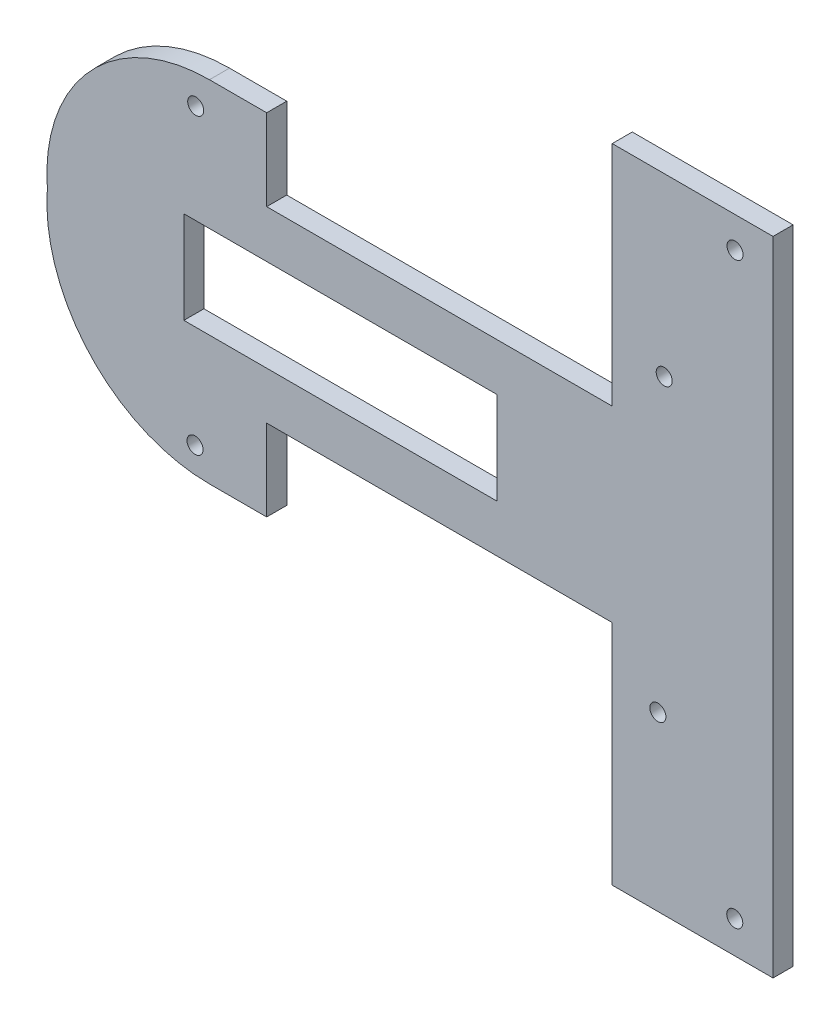
ISO-10303-21;
HEADER;
FILE_DESCRIPTION(('STEP AP214'),'2;1');
FILE_NAME('part.step','',(''),(''),'','','');
FILE_SCHEMA(('AUTOMOTIVE_DESIGN { 1 0 10303 214 1 1 1 1 }'));
ENDSEC;
DATA;
#1=APPLICATION_CONTEXT('core data for automotive mechanical design processes');
#2=APPLICATION_PROTOCOL_DEFINITION('international standard','automotive_design',2000,#1);
#3=PRODUCT_CONTEXT('',#1,'mechanical');
#4=PRODUCT('Part','Part','',(#3));
#5=PRODUCT_RELATED_PRODUCT_CATEGORY('part','',(#4));
#6=PRODUCT_DEFINITION_FORMATION('','',#4);
#7=PRODUCT_DEFINITION_CONTEXT('part definition',#1,'design');
#8=PRODUCT_DEFINITION('design','',#6,#7);
#9=PRODUCT_DEFINITION_SHAPE('','',#8);
#10=(LENGTH_UNIT() NAMED_UNIT(*) SI_UNIT(.MILLI.,.METRE.));
#11=(NAMED_UNIT(*) PLANE_ANGLE_UNIT() SI_UNIT($,.RADIAN.));
#12=(NAMED_UNIT(*) SI_UNIT($,.STERADIAN.) SOLID_ANGLE_UNIT());
#13=UNCERTAINTY_MEASURE_WITH_UNIT(LENGTH_MEASURE(1.E-05),#10,'distance_accuracy_value','');
#14=(GEOMETRIC_REPRESENTATION_CONTEXT(3) GLOBAL_UNCERTAINTY_ASSIGNED_CONTEXT((#13)) GLOBAL_UNIT_ASSIGNED_CONTEXT((#10,
#11,#12)) REPRESENTATION_CONTEXT('',''));
#15=CARTESIAN_POINT('',(0.,0.,0.));
#16=DIRECTION('',(0.,0.,1.));
#17=DIRECTION('',(1.,0.,0.));
#18=AXIS2_PLACEMENT_3D('',#15,#16,#17);
#19=CARTESIAN_POINT('',(-140.404811955513,-3.10456604475191,5.));
#20=DIRECTION('',(0.,0.,-1.));
#21=DIRECTION('',(-1.,0.,0.));
#22=AXIS2_PLACEMENT_3D('',#19,#20,#21);
#23=PLANE('',#22);
#24=DIRECTION('',(0.,-1.,0.));
#25=VECTOR('',#24,1.);
#26=CARTESIAN_POINT('',(-146.776795964577,-11.5,5.));
#27=LINE('',#26,#25);
#28=CARTESIAN_POINT('',(-146.776795964577,11.5,5.));
#29=VERTEX_POINT('',#28);
#30=CARTESIAN_POINT('',(-146.776795964577,-11.5,5.));
#31=VERTEX_POINT('',#30);
#32=EDGE_CURVE('E179',#29,#31,#27,.T.);
#33=ORIENTED_EDGE('',*,*,#32,.F.);
#34=DIRECTION('',(-1.,0.,0.));
#35=VECTOR('',#34,1.);
#36=CARTESIAN_POINT('',(-146.776795964577,11.5,5.));
#37=LINE('',#36,#35);
#38=CARTESIAN_POINT('',(-68.7767959645772,11.5,5.));
#39=VERTEX_POINT('',#38);
#40=EDGE_CURVE('E48',#39,#29,#37,.T.);
#41=ORIENTED_EDGE('',*,*,#40,.F.);
#42=DIRECTION('',(0.,1.,0.));
#43=VECTOR('',#42,1.);
#44=CARTESIAN_POINT('',(-68.7767959645772,11.5,5.));
#45=LINE('',#44,#43);
#46=CARTESIAN_POINT('',(-68.7767959645772,-11.5,5.));
#47=VERTEX_POINT('',#46);
#48=EDGE_CURVE('E170',#47,#39,#45,.T.);
#49=ORIENTED_EDGE('',*,*,#48,.F.);
#50=DIRECTION('',(1.,0.,0.));
#51=VECTOR('',#50,1.);
#52=CARTESIAN_POINT('',(-146.776795964577,-11.5,5.));
#53=LINE('',#52,#51);
#54=EDGE_CURVE('E173',#31,#47,#53,.T.);
#55=ORIENTED_EDGE('',*,*,#54,.F.);
#56=EDGE_LOOP('',(#33,#41,#49,#55));
#57=FACE_BOUND('',#56,.T.);
#58=CARTESIAN_POINT('',(-140.404811955513,-3.10456604475191,5.));
#59=DIRECTION('',(0.,0.,1.));
#60=DIRECTION('',(-1.,0.,0.));
#61=AXIS2_PLACEMENT_3D('',#58,#59,#60);
#62=CIRCLE('',#61,40.5034622947359);
#63=CARTESIAN_POINT('',(-180.789117416111,0.,5.));
#64=VERTEX_POINT('',#63);
#65=CARTESIAN_POINT('',(-140.404811955513,-43.6080283394878,5.));
#66=VERTEX_POINT('',#65);
#67=EDGE_CURVE('E225',#64,#66,#62,.T.);
#68=ORIENTED_EDGE('',*,*,#67,.T.);
#69=DIRECTION('',(1.,0.,0.));
#70=VECTOR('',#69,1.);
#71=CARTESIAN_POINT('',(-140.404811955513,-43.6080283394878,5.));
#72=LINE('',#71,#70);
#73=CARTESIAN_POINT('',(-126.14466040982,-43.6080283394878,5.));
#74=VERTEX_POINT('',#73);
#75=EDGE_CURVE('E228',#66,#74,#72,.T.);
#76=ORIENTED_EDGE('',*,*,#75,.T.);
#77=DIRECTION('',(0.,1.,0.));
#78=VECTOR('',#77,1.);
#79=CARTESIAN_POINT('',(-126.14466040982,-43.6080283394878,5.));
#80=LINE('',#79,#78);
#81=CARTESIAN_POINT('',(-126.14466040982,-23.3472038346006,5.));
#82=VERTEX_POINT('',#81);
#83=EDGE_CURVE('E231',#74,#82,#80,.T.);
#84=ORIENTED_EDGE('',*,*,#83,.T.);
#85=DIRECTION('',(1.,0.,0.));
#86=VECTOR('',#85,1.);
#87=CARTESIAN_POINT('',(-126.14466040982,-23.3472038346006,5.));
#88=LINE('',#87,#86);
#89=CARTESIAN_POINT('',(-40.0633573953098,-23.3472038346006,5.));
#90=VERTEX_POINT('',#89);
#91=EDGE_CURVE('E233',#82,#90,#88,.T.);
#92=ORIENTED_EDGE('',*,*,#91,.T.);
#93=DIRECTION('',(0.,-1.,0.));
#94=VECTOR('',#93,1.);
#95=CARTESIAN_POINT('',(-40.0633573953098,-23.3472038346006,5.));
#96=LINE('',#95,#94);
#97=CARTESIAN_POINT('',(-40.0633573953098,-80.,5.));
#98=VERTEX_POINT('',#97);
#99=EDGE_CURVE('E235',#90,#98,#96,.T.);
#100=ORIENTED_EDGE('',*,*,#99,.T.);
#101=DIRECTION('',(1.,0.,0.));
#102=VECTOR('',#101,1.);
#103=CARTESIAN_POINT('',(0.,-80.,5.));
#104=LINE('',#103,#102);
#105=CARTESIAN_POINT('',(0.,-80.,5.));
#106=VERTEX_POINT('',#105);
#107=EDGE_CURVE('E237',#98,#106,#104,.T.);
#108=ORIENTED_EDGE('',*,*,#107,.T.);
#109=DIRECTION('',(0.,1.,0.));
#110=VECTOR('',#109,1.);
#111=CARTESIAN_POINT('',(0.,-80.,5.));
#112=LINE('',#111,#110);
#113=CARTESIAN_POINT('',(0.,80.,5.));
#114=VERTEX_POINT('',#113);
#115=EDGE_CURVE('E239',#106,#114,#112,.T.);
#116=ORIENTED_EDGE('',*,*,#115,.T.);
#117=DIRECTION('',(-1.,0.,0.));
#118=VECTOR('',#117,1.);
#119=CARTESIAN_POINT('',(0.,80.,5.));
#120=LINE('',#119,#118);
#121=CARTESIAN_POINT('',(-40.0633573953098,80.,5.));
#122=VERTEX_POINT('',#121);
#123=EDGE_CURVE('E241',#114,#122,#120,.T.);
#124=ORIENTED_EDGE('',*,*,#123,.T.);
#125=DIRECTION('',(0.,-1.,0.));
#126=VECTOR('',#125,1.);
#127=CARTESIAN_POINT('',(-40.0633573953098,80.,5.));
#128=LINE('',#127,#126);
#129=CARTESIAN_POINT('',(-40.0633573953098,23.3472038346006,5.));
#130=VERTEX_POINT('',#129);
#131=EDGE_CURVE('E243',#122,#130,#128,.T.);
#132=ORIENTED_EDGE('',*,*,#131,.T.);
#133=DIRECTION('',(-1.,0.,0.));
#134=VECTOR('',#133,1.);
#135=CARTESIAN_POINT('',(-126.14466040982,23.3472038346006,5.));
#136=LINE('',#135,#134);
#137=CARTESIAN_POINT('',(-126.14466040982,23.3472038346006,5.));
#138=VERTEX_POINT('',#137);
#139=EDGE_CURVE('E245',#130,#138,#136,.T.);
#140=ORIENTED_EDGE('',*,*,#139,.T.);
#141=DIRECTION('',(0.,1.,0.));
#142=VECTOR('',#141,1.);
#143=CARTESIAN_POINT('',(-126.14466040982,43.6080283394878,5.));
#144=LINE('',#143,#142);
#145=CARTESIAN_POINT('',(-126.14466040982,43.6080283394878,5.));
#146=VERTEX_POINT('',#145);
#147=EDGE_CURVE('E247',#138,#146,#144,.T.);
#148=ORIENTED_EDGE('',*,*,#147,.T.);
#149=DIRECTION('',(-1.,0.,0.));
#150=VECTOR('',#149,1.);
#151=CARTESIAN_POINT('',(-140.404811955513,43.6080283394878,5.));
#152=LINE('',#151,#150);
#153=CARTESIAN_POINT('',(-140.404811955513,43.6080283394878,5.));
#154=VERTEX_POINT('',#153);
#155=EDGE_CURVE('E249',#146,#154,#152,.T.);
#156=ORIENTED_EDGE('',*,*,#155,.T.);
#157=CARTESIAN_POINT('',(-140.404811955513,3.10456604475187,5.));
#158=DIRECTION('',(0.,0.,1.));
#159=DIRECTION('',(1.,0.,0.));
#160=AXIS2_PLACEMENT_3D('',#157,#158,#159);
#161=CIRCLE('',#160,40.5034622947359);
#162=EDGE_CURVE('E251',#154,#64,#161,.T.);
#163=ORIENTED_EDGE('',*,*,#162,.T.);
#164=EDGE_LOOP('',(#68,#76,#84,#92,#100,#108,#116,#124,#132,#140,#148,#156,#163));
#165=FACE_BOUND('',#164,.T.);
#166=CARTESIAN_POINT('',(-9.53802285725849,-71.9475460170679,5.));
#167=DIRECTION('',(0.,0.,1.));
#168=DIRECTION('',(-1.,0.,0.));
#169=AXIS2_PLACEMENT_3D('',#166,#167,#168);
#170=CIRCLE('',#169,2.);
#171=CARTESIAN_POINT('',(-11.5380228572585,-71.9475460170679,5.));
#172=VERTEX_POINT('',#171);
#173=EDGE_CURVE('E219',#172,#172,#170,.T.);
#174=ORIENTED_EDGE('',*,*,#173,.F.);
#175=EDGE_LOOP('',(#174));
#176=FACE_BOUND('',#175,.T.);
#177=CARTESIAN_POINT('',(-143.829395776863,36.2065798242247,5.));
#178=DIRECTION('',(0.,0.,1.));
#179=DIRECTION('',(1.,0.,0.));
#180=AXIS2_PLACEMENT_3D('',#177,#178,#179);
#181=CIRCLE('',#180,2.);
#182=CARTESIAN_POINT('',(-141.829395776863,36.2065798242247,5.));
#183=VERTEX_POINT('',#182);
#184=EDGE_CURVE('E213',#183,#183,#181,.T.);
#185=ORIENTED_EDGE('',*,*,#184,.F.);
#186=EDGE_LOOP('',(#185));
#187=FACE_BOUND('',#186,.T.);
#188=CARTESIAN_POINT('',(-27.1130683064686,36.2065798242247,5.));
#189=DIRECTION('',(0.,0.,1.));
#190=DIRECTION('',(1.,0.,0.));
#191=AXIS2_PLACEMENT_3D('',#188,#189,#190);
#192=CIRCLE('',#191,2.);
#193=CARTESIAN_POINT('',(-25.1130683064686,36.2065798242247,5.));
#194=VERTEX_POINT('',#193);
#195=EDGE_CURVE('E207',#194,#194,#192,.T.);
#196=ORIENTED_EDGE('',*,*,#195,.F.);
#197=EDGE_LOOP('',(#196));
#198=FACE_BOUND('',#197,.T.);
#199=CARTESIAN_POINT('',(-28.6903159749874,-37.0227762141505,5.));
#200=DIRECTION('',(0.,0.,1.));
#201=DIRECTION('',(-1.,0.,0.));
#202=AXIS2_PLACEMENT_3D('',#199,#200,#201);
#203=CIRCLE('',#202,2.);
#204=CARTESIAN_POINT('',(-30.6903159749874,-37.0227762141505,5.));
#205=VERTEX_POINT('',#204);
#206=EDGE_CURVE('E201',#205,#205,#203,.T.);
#207=ORIENTED_EDGE('',*,*,#206,.F.);
#208=EDGE_LOOP('',(#207));
#209=FACE_BOUND('',#208,.T.);
#210=CARTESIAN_POINT('',(-143.994710804854,-37.0227762141505,5.));
#211=DIRECTION('',(0.,0.,1.));
#212=DIRECTION('',(-1.,0.,0.));
#213=AXIS2_PLACEMENT_3D('',#210,#211,#212);
#214=CIRCLE('',#213,2.);
#215=CARTESIAN_POINT('',(-145.994710804854,-37.0227762141505,5.));
#216=VERTEX_POINT('',#215);
#217=EDGE_CURVE('E195',#216,#216,#214,.T.);
#218=ORIENTED_EDGE('',*,*,#217,.F.);
#219=EDGE_LOOP('',(#218));
#220=FACE_BOUND('',#219,.T.);
#221=CARTESIAN_POINT('',(-9.46712879267102,72.2918239197636,5.));
#222=DIRECTION('',(0.,0.,1.));
#223=DIRECTION('',(1.,0.,0.));
#224=AXIS2_PLACEMENT_3D('',#221,#222,#223);
#225=CIRCLE('',#224,2.);
#226=CARTESIAN_POINT('',(-7.46712879267102,72.2918239197636,5.));
#227=VERTEX_POINT('',#226);
#228=EDGE_CURVE('E189',#227,#227,#225,.T.);
#229=ORIENTED_EDGE('',*,*,#228,.F.);
#230=EDGE_LOOP('',(#229));
#231=FACE_BOUND('',#230,.T.);
#232=ADVANCED_FACE('F33',(#57,#165,#176,#187,#198,#209,#220,#231),#23,.F.);
#233=CARTESIAN_POINT('',(-140.404811955513,-3.10456604475191,0.));
#234=DIRECTION('',(0.,0.,-1.));
#235=DIRECTION('',(-1.,0.,0.));
#236=AXIS2_PLACEMENT_3D('',#233,#234,#235);
#237=PLANE('',#236);
#238=DIRECTION('',(-1.,0.,0.));
#239=VECTOR('',#238,1.);
#240=CARTESIAN_POINT('',(-146.776795964577,11.5,0.));
#241=LINE('',#240,#239);
#242=CARTESIAN_POINT('',(-68.7767959645772,11.5,0.));
#243=VERTEX_POINT('',#242);
#244=CARTESIAN_POINT('',(-146.776795964577,11.5,0.));
#245=VERTEX_POINT('',#244);
#246=EDGE_CURVE('E154',#243,#245,#241,.T.);
#247=ORIENTED_EDGE('',*,*,#246,.T.);
#248=DIRECTION('',(0.,-1.,0.));
#249=VECTOR('',#248,1.);
#250=CARTESIAN_POINT('',(-146.776795964577,-11.5,0.));
#251=LINE('',#250,#249);
#252=CARTESIAN_POINT('',(-146.776795964577,-11.5,0.));
#253=VERTEX_POINT('',#252);
#254=EDGE_CURVE('E163',#245,#253,#251,.T.);
#255=ORIENTED_EDGE('',*,*,#254,.T.);
#256=DIRECTION('',(1.,0.,0.));
#257=VECTOR('',#256,1.);
#258=CARTESIAN_POINT('',(-146.776795964577,-11.5,0.));
#259=LINE('',#258,#257);
#260=CARTESIAN_POINT('',(-68.7767959645772,-11.5,0.));
#261=VERTEX_POINT('',#260);
#262=EDGE_CURVE('E56',#253,#261,#259,.T.);
#263=ORIENTED_EDGE('',*,*,#262,.T.);
#264=DIRECTION('',(0.,1.,0.));
#265=VECTOR('',#264,1.);
#266=CARTESIAN_POINT('',(-68.7767959645772,11.5,0.));
#267=LINE('',#266,#265);
#268=EDGE_CURVE('E160',#261,#243,#267,.T.);
#269=ORIENTED_EDGE('',*,*,#268,.T.);
#270=EDGE_LOOP('',(#247,#255,#263,#269));
#271=FACE_BOUND('',#270,.T.);
#272=CARTESIAN_POINT('',(-143.994710804854,-37.0227762141505,0.));
#273=DIRECTION('',(0.,0.,1.));
#274=DIRECTION('',(-1.,0.,0.));
#275=AXIS2_PLACEMENT_3D('',#272,#273,#274);
#276=CIRCLE('',#275,2.);
#277=CARTESIAN_POINT('',(-145.994710804854,-37.0227762141505,0.));
#278=VERTEX_POINT('',#277);
#279=EDGE_CURVE('E192',#278,#278,#276,.T.);
#280=ORIENTED_EDGE('',*,*,#279,.T.);
#281=EDGE_LOOP('',(#280));
#282=FACE_BOUND('',#281,.T.);
#283=CARTESIAN_POINT('',(-27.1130683064686,36.2065798242247,0.));
#284=DIRECTION('',(0.,0.,1.));
#285=DIRECTION('',(1.,0.,0.));
#286=AXIS2_PLACEMENT_3D('',#283,#284,#285);
#287=CIRCLE('',#286,2.);
#288=CARTESIAN_POINT('',(-25.1130683064686,36.2065798242247,0.));
#289=VERTEX_POINT('',#288);
#290=EDGE_CURVE('E204',#289,#289,#287,.T.);
#291=ORIENTED_EDGE('',*,*,#290,.T.);
#292=EDGE_LOOP('',(#291));
#293=FACE_BOUND('',#292,.T.);
#294=CARTESIAN_POINT('',(-9.53802285725849,-71.9475460170679,0.));
#295=DIRECTION('',(0.,0.,1.));
#296=DIRECTION('',(-1.,0.,0.));
#297=AXIS2_PLACEMENT_3D('',#294,#295,#296);
#298=CIRCLE('',#297,2.);
#299=CARTESIAN_POINT('',(-11.5380228572585,-71.9475460170679,0.));
#300=VERTEX_POINT('',#299);
#301=EDGE_CURVE('E216',#300,#300,#298,.T.);
#302=ORIENTED_EDGE('',*,*,#301,.T.);
#303=EDGE_LOOP('',(#302));
#304=FACE_BOUND('',#303,.T.);
#305=CARTESIAN_POINT('',(-140.404811955513,-3.10456604475191,0.));
#306=DIRECTION('',(0.,0.,1.));
#307=DIRECTION('',(-1.,0.,0.));
#308=AXIS2_PLACEMENT_3D('',#305,#306,#307);
#309=CIRCLE('',#308,40.5034622947359);
#310=CARTESIAN_POINT('',(-180.789117416111,0.,0.));
#311=VERTEX_POINT('',#310);
#312=CARTESIAN_POINT('',(-140.404811955513,-43.6080283394878,0.));
#313=VERTEX_POINT('',#312);
#314=EDGE_CURVE('E222',#311,#313,#309,.T.);
#315=ORIENTED_EDGE('',*,*,#314,.F.);
#316=CARTESIAN_POINT('',(-140.404811955513,3.10456604475187,0.));
#317=DIRECTION('',(0.,0.,1.));
#318=DIRECTION('',(1.,0.,0.));
#319=AXIS2_PLACEMENT_3D('',#316,#317,#318);
#320=CIRCLE('',#319,40.5034622947359);
#321=CARTESIAN_POINT('',(-140.404811955513,43.6080283394878,0.));
#322=VERTEX_POINT('',#321);
#323=EDGE_CURVE('E229',#322,#311,#320,.T.);
#324=ORIENTED_EDGE('',*,*,#323,.F.);
#325=DIRECTION('',(-1.,0.,0.));
#326=VECTOR('',#325,1.);
#327=CARTESIAN_POINT('',(-140.404811955513,43.6080283394878,0.));
#328=LINE('',#327,#326);
#329=CARTESIAN_POINT('',(-126.14466040982,43.6080283394878,0.));
#330=VERTEX_POINT('',#329);
#331=EDGE_CURVE('E278',#330,#322,#328,.T.);
#332=ORIENTED_EDGE('',*,*,#331,.F.);
#333=DIRECTION('',(0.,1.,0.));
#334=VECTOR('',#333,1.);
#335=CARTESIAN_POINT('',(-126.14466040982,43.6080283394878,0.));
#336=LINE('',#335,#334);
#337=CARTESIAN_POINT('',(-126.14466040982,23.3472038346006,0.));
#338=VERTEX_POINT('',#337);
#339=EDGE_CURVE('E276',#338,#330,#336,.T.);
#340=ORIENTED_EDGE('',*,*,#339,.F.);
#341=DIRECTION('',(-1.,0.,0.));
#342=VECTOR('',#341,1.);
#343=CARTESIAN_POINT('',(-126.14466040982,23.3472038346006,0.));
#344=LINE('',#343,#342);
#345=CARTESIAN_POINT('',(-40.0633573953098,23.3472038346006,0.));
#346=VERTEX_POINT('',#345);
#347=EDGE_CURVE('E274',#346,#338,#344,.T.);
#348=ORIENTED_EDGE('',*,*,#347,.F.);
#349=DIRECTION('',(0.,-1.,0.));
#350=VECTOR('',#349,1.);
#351=CARTESIAN_POINT('',(-40.0633573953098,23.3472038346006,0.));
#352=LINE('',#351,#350);
#353=CARTESIAN_POINT('',(-40.0633573953098,80.,0.));
#354=VERTEX_POINT('',#353);
#355=EDGE_CURVE('E272',#354,#346,#352,.T.);
#356=ORIENTED_EDGE('',*,*,#355,.F.);
#357=DIRECTION('',(-1.,0.,0.));
#358=VECTOR('',#357,1.);
#359=CARTESIAN_POINT('',(0.,80.,0.));
#360=LINE('',#359,#358);
#361=CARTESIAN_POINT('',(0.,80.,0.));
#362=VERTEX_POINT('',#361);
#363=EDGE_CURVE('E269',#362,#354,#360,.T.);
#364=ORIENTED_EDGE('',*,*,#363,.F.);
#365=DIRECTION('',(0.,1.,0.));
#366=VECTOR('',#365,1.);
#367=CARTESIAN_POINT('',(0.,-80.,0.));
#368=LINE('',#367,#366);
#369=CARTESIAN_POINT('',(0.,-80.,0.));
#370=VERTEX_POINT('',#369);
#371=EDGE_CURVE('E267',#370,#362,#368,.T.);
#372=ORIENTED_EDGE('',*,*,#371,.F.);
#373=DIRECTION('',(1.,0.,0.));
#374=VECTOR('',#373,1.);
#375=CARTESIAN_POINT('',(0.,-80.,0.));
#376=LINE('',#375,#374);
#377=CARTESIAN_POINT('',(-40.0633573953098,-80.,0.));
#378=VERTEX_POINT('',#377);
#379=EDGE_CURVE('E265',#378,#370,#376,.T.);
#380=ORIENTED_EDGE('',*,*,#379,.F.);
#381=DIRECTION('',(0.,-1.,0.));
#382=VECTOR('',#381,1.);
#383=CARTESIAN_POINT('',(-40.0633573953098,-80.,0.));
#384=LINE('',#383,#382);
#385=CARTESIAN_POINT('',(-40.0633573953098,-23.3472038346006,0.));
#386=VERTEX_POINT('',#385);
#387=EDGE_CURVE('E263',#386,#378,#384,.T.);
#388=ORIENTED_EDGE('',*,*,#387,.F.);
#389=DIRECTION('',(1.,0.,0.));
#390=VECTOR('',#389,1.);
#391=CARTESIAN_POINT('',(-126.14466040982,-23.3472038346006,0.));
#392=LINE('',#391,#390);
#393=CARTESIAN_POINT('',(-126.14466040982,-23.3472038346006,0.));
#394=VERTEX_POINT('',#393);
#395=EDGE_CURVE('E260',#394,#386,#392,.T.);
#396=ORIENTED_EDGE('',*,*,#395,.F.);
#397=DIRECTION('',(0.,1.,0.));
#398=VECTOR('',#397,1.);
#399=CARTESIAN_POINT('',(-126.14466040982,-43.6080283394878,0.));
#400=LINE('',#399,#398);
#401=CARTESIAN_POINT('',(-126.14466040982,-43.6080283394878,0.));
#402=VERTEX_POINT('',#401);
#403=EDGE_CURVE('E258',#402,#394,#400,.T.);
#404=ORIENTED_EDGE('',*,*,#403,.F.);
#405=DIRECTION('',(1.,0.,0.));
#406=VECTOR('',#405,1.);
#407=CARTESIAN_POINT('',(-140.404811955513,-43.6080283394878,0.));
#408=LINE('',#407,#406);
#409=EDGE_CURVE('E256',#313,#402,#408,.T.);
#410=ORIENTED_EDGE('',*,*,#409,.F.);
#411=EDGE_LOOP('',(#315,#324,#332,#340,#348,#356,#364,#372,#380,#388,#396,#404,#410));
#412=FACE_BOUND('',#411,.T.);
#413=CARTESIAN_POINT('',(-143.829395776863,36.2065798242247,0.));
#414=DIRECTION('',(0.,0.,1.));
#415=DIRECTION('',(1.,0.,0.));
#416=AXIS2_PLACEMENT_3D('',#413,#414,#415);
#417=CIRCLE('',#416,2.);
#418=CARTESIAN_POINT('',(-141.829395776863,36.2065798242247,0.));
#419=VERTEX_POINT('',#418);
#420=EDGE_CURVE('E210',#419,#419,#417,.T.);
#421=ORIENTED_EDGE('',*,*,#420,.T.);
#422=EDGE_LOOP('',(#421));
#423=FACE_BOUND('',#422,.T.);
#424=CARTESIAN_POINT('',(-28.6903159749874,-37.0227762141505,0.));
#425=DIRECTION('',(0.,0.,1.));
#426=DIRECTION('',(-1.,0.,0.));
#427=AXIS2_PLACEMENT_3D('',#424,#425,#426);
#428=CIRCLE('',#427,2.);
#429=CARTESIAN_POINT('',(-30.6903159749874,-37.0227762141505,0.));
#430=VERTEX_POINT('',#429);
#431=EDGE_CURVE('E198',#430,#430,#428,.T.);
#432=ORIENTED_EDGE('',*,*,#431,.T.);
#433=EDGE_LOOP('',(#432));
#434=FACE_BOUND('',#433,.T.);
#435=CARTESIAN_POINT('',(-9.46712879267102,72.2918239197636,0.));
#436=DIRECTION('',(0.,0.,1.));
#437=DIRECTION('',(1.,0.,0.));
#438=AXIS2_PLACEMENT_3D('',#435,#436,#437);
#439=CIRCLE('',#438,2.);
#440=CARTESIAN_POINT('',(-7.46712879267102,72.2918239197636,0.));
#441=VERTEX_POINT('',#440);
#442=EDGE_CURVE('E185',#441,#441,#439,.T.);
#443=ORIENTED_EDGE('',*,*,#442,.T.);
#444=EDGE_LOOP('',(#443));
#445=FACE_BOUND('',#444,.T.);
#446=ADVANCED_FACE('F167',(#271,#282,#293,#304,#412,#423,#434,#445),#237,.T.);
#447=CARTESIAN_POINT('',(-140.404811955513,-3.10456604475191,5.));
#448=DIRECTION('',(0.,0.,-1.));
#449=DIRECTION('',(-1.,0.,0.));
#450=AXIS2_PLACEMENT_3D('',#447,#448,#449);
#451=CYLINDRICAL_SURFACE('',#450,40.5034622947359);
#452=ORIENTED_EDGE('',*,*,#314,.T.);
#453=DIRECTION('',(0.,0.,-1.));
#454=VECTOR('',#453,1.);
#455=CARTESIAN_POINT('',(-140.404811955513,-43.6080283394878,5.));
#456=LINE('',#455,#454);
#457=EDGE_CURVE('E11',#66,#313,#456,.T.);
#458=ORIENTED_EDGE('',*,*,#457,.F.);
#459=ORIENTED_EDGE('',*,*,#67,.F.);
#460=DIRECTION('',(0.,0.,-1.));
#461=VECTOR('',#460,1.);
#462=CARTESIAN_POINT('',(-180.789117416111,0.,5.));
#463=LINE('',#462,#461);
#464=EDGE_CURVE('E253',#64,#311,#463,.T.);
#465=ORIENTED_EDGE('',*,*,#464,.T.);
#466=EDGE_LOOP('',(#452,#458,#459,#465));
#467=FACE_BOUND('',#466,.T.);
#468=ADVANCED_FACE('F35',(#467),#451,.T.);
#469=CARTESIAN_POINT('',(-140.404811955513,-43.6080283394878,5.));
#470=DIRECTION('',(0.,1.,0.));
#471=DIRECTION('',(0.,0.,1.));
#472=AXIS2_PLACEMENT_3D('',#469,#470,#471);
#473=PLANE('',#472);
#474=ORIENTED_EDGE('',*,*,#409,.T.);
#475=DIRECTION('',(0.,0.,-1.));
#476=VECTOR('',#475,1.);
#477=CARTESIAN_POINT('',(-126.14466040982,-43.6080283394878,5.));
#478=LINE('',#477,#476);
#479=EDGE_CURVE('E41',#74,#402,#478,.T.);
#480=ORIENTED_EDGE('',*,*,#479,.F.);
#481=ORIENTED_EDGE('',*,*,#75,.F.);
#482=ORIENTED_EDGE('',*,*,#457,.T.);
#483=EDGE_LOOP('',(#474,#480,#481,#482));
#484=FACE_BOUND('',#483,.T.);
#485=ADVANCED_FACE('F339',(#484),#473,.F.);
#486=CARTESIAN_POINT('',(-126.14466040982,-43.6080283394878,5.));
#487=DIRECTION('',(-1.,0.,0.));
#488=DIRECTION('',(0.,-1.,0.));
#489=AXIS2_PLACEMENT_3D('',#486,#487,#488);
#490=PLANE('',#489);
#491=ORIENTED_EDGE('',*,*,#403,.T.);
#492=DIRECTION('',(0.,0.,-1.));
#493=VECTOR('',#492,1.);
#494=CARTESIAN_POINT('',(-126.14466040982,-23.3472038346006,5.));
#495=LINE('',#494,#493);
#496=EDGE_CURVE('E310',#82,#394,#495,.T.);
#497=ORIENTED_EDGE('',*,*,#496,.F.);
#498=ORIENTED_EDGE('',*,*,#83,.F.);
#499=ORIENTED_EDGE('',*,*,#479,.T.);
#500=EDGE_LOOP('',(#491,#497,#498,#499));
#501=FACE_BOUND('',#500,.T.);
#502=ADVANCED_FACE('F317',(#501),#490,.F.);
#503=CARTESIAN_POINT('',(-126.14466040982,-23.3472038346006,5.));
#504=DIRECTION('',(0.,1.,0.));
#505=DIRECTION('',(-1.,0.,0.));
#506=AXIS2_PLACEMENT_3D('',#503,#504,#505);
#507=PLANE('',#506);
#508=ORIENTED_EDGE('',*,*,#395,.T.);
#509=DIRECTION('',(0.,0.,-1.));
#510=VECTOR('',#509,1.);
#511=CARTESIAN_POINT('',(-40.0633573953098,-23.3472038346006,5.));
#512=LINE('',#511,#510);
#513=EDGE_CURVE('E307',#90,#386,#512,.T.);
#514=ORIENTED_EDGE('',*,*,#513,.F.);
#515=ORIENTED_EDGE('',*,*,#91,.F.);
#516=ORIENTED_EDGE('',*,*,#496,.T.);
#517=EDGE_LOOP('',(#508,#514,#515,#516));
#518=FACE_BOUND('',#517,.T.);
#519=ADVANCED_FACE('F327',(#518),#507,.F.);
#520=CARTESIAN_POINT('',(-40.0633573953098,-80.,5.));
#521=DIRECTION('',(1.,0.,0.));
#522=DIRECTION('',(0.,0.,-1.));
#523=AXIS2_PLACEMENT_3D('',#520,#521,#522);
#524=PLANE('',#523);
#525=ORIENTED_EDGE('',*,*,#387,.T.);
#526=DIRECTION('',(0.,0.,-1.));
#527=VECTOR('',#526,1.);
#528=CARTESIAN_POINT('',(-40.0633573953098,-80.,5.));
#529=LINE('',#528,#527);
#530=EDGE_CURVE('E304',#98,#378,#529,.T.);
#531=ORIENTED_EDGE('',*,*,#530,.F.);
#532=ORIENTED_EDGE('',*,*,#99,.F.);
#533=ORIENTED_EDGE('',*,*,#513,.T.);
#534=EDGE_LOOP('',(#525,#531,#532,#533));
#535=FACE_BOUND('',#534,.T.);
#536=ADVANCED_FACE('F331',(#535),#524,.F.);
#537=CARTESIAN_POINT('',(0.,-80.,5.));
#538=DIRECTION('',(0.,1.,0.));
#539=DIRECTION('',(-1.,0.,0.));
#540=AXIS2_PLACEMENT_3D('',#537,#538,#539);
#541=PLANE('',#540);
#542=ORIENTED_EDGE('',*,*,#379,.T.);
#543=DIRECTION('',(0.,0.,-1.));
#544=VECTOR('',#543,1.);
#545=CARTESIAN_POINT('',(0.,-80.,5.));
#546=LINE('',#545,#544);
#547=EDGE_CURVE('E301',#106,#370,#546,.T.);
#548=ORIENTED_EDGE('',*,*,#547,.F.);
#549=ORIENTED_EDGE('',*,*,#107,.F.);
#550=ORIENTED_EDGE('',*,*,#530,.T.);
#551=EDGE_LOOP('',(#542,#548,#549,#550));
#552=FACE_BOUND('',#551,.T.);
#553=ADVANCED_FACE('F376',(#552),#541,.F.);
#554=CARTESIAN_POINT('',(0.,-80.,5.));
#555=DIRECTION('',(-1.,0.,0.));
#556=DIRECTION('',(0.,0.,1.));
#557=AXIS2_PLACEMENT_3D('',#554,#555,#556);
#558=PLANE('',#557);
#559=ORIENTED_EDGE('',*,*,#371,.T.);
#560=DIRECTION('',(0.,0.,-1.));
#561=VECTOR('',#560,1.);
#562=CARTESIAN_POINT('',(0.,80.,5.));
#563=LINE('',#562,#561);
#564=EDGE_CURVE('E298',#114,#362,#563,.T.);
#565=ORIENTED_EDGE('',*,*,#564,.F.);
#566=ORIENTED_EDGE('',*,*,#115,.F.);
#567=ORIENTED_EDGE('',*,*,#547,.T.);
#568=EDGE_LOOP('',(#559,#565,#566,#567));
#569=FACE_BOUND('',#568,.T.);
#570=ADVANCED_FACE('F373',(#569),#558,.F.);
#571=CARTESIAN_POINT('',(0.,80.,5.));
#572=DIRECTION('',(0.,-1.,0.));
#573=DIRECTION('',(0.,0.,-1.));
#574=AXIS2_PLACEMENT_3D('',#571,#572,#573);
#575=PLANE('',#574);
#576=ORIENTED_EDGE('',*,*,#363,.T.);
#577=DIRECTION('',(0.,0.,-1.));
#578=VECTOR('',#577,1.);
#579=CARTESIAN_POINT('',(-40.0633573953098,80.,5.));
#580=LINE('',#579,#578);
#581=EDGE_CURVE('E295',#122,#354,#580,.T.);
#582=ORIENTED_EDGE('',*,*,#581,.F.);
#583=ORIENTED_EDGE('',*,*,#123,.F.);
#584=ORIENTED_EDGE('',*,*,#564,.T.);
#585=EDGE_LOOP('',(#576,#582,#583,#584));
#586=FACE_BOUND('',#585,.T.);
#587=ADVANCED_FACE('F369',(#586),#575,.F.);
#588=CARTESIAN_POINT('',(-40.0633573953098,23.3472038346006,5.));
#589=DIRECTION('',(1.,0.,0.));
#590=DIRECTION('',(0.,0.,-1.));
#591=AXIS2_PLACEMENT_3D('',#588,#589,#590);
#592=PLANE('',#591);
#593=ORIENTED_EDGE('',*,*,#355,.T.);
#594=DIRECTION('',(0.,0.,-1.));
#595=VECTOR('',#594,1.);
#596=CARTESIAN_POINT('',(-40.0633573953098,23.3472038346006,5.));
#597=LINE('',#596,#595);
#598=EDGE_CURVE('E292',#130,#346,#597,.T.);
#599=ORIENTED_EDGE('',*,*,#598,.F.);
#600=ORIENTED_EDGE('',*,*,#131,.F.);
#601=ORIENTED_EDGE('',*,*,#581,.T.);
#602=EDGE_LOOP('',(#593,#599,#600,#601));
#603=FACE_BOUND('',#602,.T.);
#604=ADVANCED_FACE('F365',(#603),#592,.F.);
#605=CARTESIAN_POINT('',(-126.14466040982,23.3472038346006,5.));
#606=DIRECTION('',(0.,-1.,0.));
#607=DIRECTION('',(0.,0.,-1.));
#608=AXIS2_PLACEMENT_3D('',#605,#606,#607);
#609=PLANE('',#608);
#610=ORIENTED_EDGE('',*,*,#347,.T.);
#611=DIRECTION('',(0.,0.,-1.));
#612=VECTOR('',#611,1.);
#613=CARTESIAN_POINT('',(-126.14466040982,23.3472038346006,5.));
#614=LINE('',#613,#612);
#615=EDGE_CURVE('E289',#138,#338,#614,.T.);
#616=ORIENTED_EDGE('',*,*,#615,.F.);
#617=ORIENTED_EDGE('',*,*,#139,.F.);
#618=ORIENTED_EDGE('',*,*,#598,.T.);
#619=EDGE_LOOP('',(#610,#616,#617,#618));
#620=FACE_BOUND('',#619,.T.);
#621=ADVANCED_FACE('F360',(#620),#609,.F.);
#622=CARTESIAN_POINT('',(-126.14466040982,43.6080283394878,5.));
#623=DIRECTION('',(-1.,0.,0.));
#624=DIRECTION('',(0.,0.,1.));
#625=AXIS2_PLACEMENT_3D('',#622,#623,#624);
#626=PLANE('',#625);
#627=ORIENTED_EDGE('',*,*,#339,.T.);
#628=DIRECTION('',(0.,0.,-1.));
#629=VECTOR('',#628,1.);
#630=CARTESIAN_POINT('',(-126.14466040982,43.6080283394878,5.));
#631=LINE('',#630,#629);
#632=EDGE_CURVE('E286',#146,#330,#631,.T.);
#633=ORIENTED_EDGE('',*,*,#632,.F.);
#634=ORIENTED_EDGE('',*,*,#147,.F.);
#635=ORIENTED_EDGE('',*,*,#615,.T.);
#636=EDGE_LOOP('',(#627,#633,#634,#635));
#637=FACE_BOUND('',#636,.T.);
#638=ADVANCED_FACE('F355',(#637),#626,.F.);
#639=CARTESIAN_POINT('',(-140.404811955513,43.6080283394878,5.));
#640=DIRECTION('',(0.,-1.,0.));
#641=DIRECTION('',(0.,0.,-1.));
#642=AXIS2_PLACEMENT_3D('',#639,#640,#641);
#643=PLANE('',#642);
#644=ORIENTED_EDGE('',*,*,#331,.T.);
#645=DIRECTION('',(0.,0.,-1.));
#646=VECTOR('',#645,1.);
#647=CARTESIAN_POINT('',(-140.404811955513,43.6080283394878,5.));
#648=LINE('',#647,#646);
#649=EDGE_CURVE('E283',#154,#322,#648,.T.);
#650=ORIENTED_EDGE('',*,*,#649,.F.);
#651=ORIENTED_EDGE('',*,*,#155,.F.);
#652=ORIENTED_EDGE('',*,*,#632,.T.);
#653=EDGE_LOOP('',(#644,#650,#651,#652));
#654=FACE_BOUND('',#653,.T.);
#655=ADVANCED_FACE('F351',(#654),#643,.F.);
#656=CARTESIAN_POINT('',(-140.404811955513,3.10456604475187,5.));
#657=DIRECTION('',(0.,0.,-1.));
#658=DIRECTION('',(-1.,0.,0.));
#659=AXIS2_PLACEMENT_3D('',#656,#657,#658);
#660=CYLINDRICAL_SURFACE('',#659,40.5034622947359);
#661=ORIENTED_EDGE('',*,*,#323,.T.);
#662=ORIENTED_EDGE('',*,*,#464,.F.);
#663=ORIENTED_EDGE('',*,*,#162,.F.);
#664=ORIENTED_EDGE('',*,*,#649,.T.);
#665=EDGE_LOOP('',(#661,#662,#663,#664));
#666=FACE_BOUND('',#665,.T.);
#667=ADVANCED_FACE('F346',(#666),#660,.T.);
#668=CARTESIAN_POINT('',(-9.53802285725849,-71.9475460170679,5.));
#669=DIRECTION('',(0.,0.,-1.));
#670=DIRECTION('',(-1.,0.,0.));
#671=AXIS2_PLACEMENT_3D('',#668,#669,#670);
#672=CYLINDRICAL_SURFACE('',#671,2.);
#673=ORIENTED_EDGE('',*,*,#173,.T.);
#674=EDGE_LOOP('',(#673));
#675=FACE_BOUND('',#674,.T.);
#676=ORIENTED_EDGE('',*,*,#301,.F.);
#677=EDGE_LOOP('',(#676));
#678=FACE_BOUND('',#677,.T.);
#679=ADVANCED_FACE('F393',(#675,#678),#672,.F.);
#680=CARTESIAN_POINT('',(-143.829395776863,36.2065798242247,5.));
#681=DIRECTION('',(0.,0.,-1.));
#682=DIRECTION('',(-1.,0.,0.));
#683=AXIS2_PLACEMENT_3D('',#680,#681,#682);
#684=CYLINDRICAL_SURFACE('',#683,2.);
#685=ORIENTED_EDGE('',*,*,#184,.T.);
#686=EDGE_LOOP('',(#685));
#687=FACE_BOUND('',#686,.T.);
#688=ORIENTED_EDGE('',*,*,#420,.F.);
#689=EDGE_LOOP('',(#688));
#690=FACE_BOUND('',#689,.T.);
#691=ADVANCED_FACE('F437',(#687,#690),#684,.F.);
#692=CARTESIAN_POINT('',(-27.1130683064686,36.2065798242247,5.));
#693=DIRECTION('',(0.,0.,-1.));
#694=DIRECTION('',(-1.,0.,0.));
#695=AXIS2_PLACEMENT_3D('',#692,#693,#694);
#696=CYLINDRICAL_SURFACE('',#695,2.);
#697=ORIENTED_EDGE('',*,*,#195,.T.);
#698=EDGE_LOOP('',(#697));
#699=FACE_BOUND('',#698,.T.);
#700=ORIENTED_EDGE('',*,*,#290,.F.);
#701=EDGE_LOOP('',(#700));
#702=FACE_BOUND('',#701,.T.);
#703=ADVANCED_FACE('F444',(#699,#702),#696,.F.);
#704=CARTESIAN_POINT('',(-28.6903159749874,-37.0227762141505,5.));
#705=DIRECTION('',(0.,0.,-1.));
#706=DIRECTION('',(-1.,0.,0.));
#707=AXIS2_PLACEMENT_3D('',#704,#705,#706);
#708=CYLINDRICAL_SURFACE('',#707,2.);
#709=ORIENTED_EDGE('',*,*,#206,.T.);
#710=EDGE_LOOP('',(#709));
#711=FACE_BOUND('',#710,.T.);
#712=ORIENTED_EDGE('',*,*,#431,.F.);
#713=EDGE_LOOP('',(#712));
#714=FACE_BOUND('',#713,.T.);
#715=ADVANCED_FACE('F451',(#711,#714),#708,.F.);
#716=CARTESIAN_POINT('',(-143.994710804854,-37.0227762141505,5.));
#717=DIRECTION('',(0.,0.,-1.));
#718=DIRECTION('',(-1.,0.,0.));
#719=AXIS2_PLACEMENT_3D('',#716,#717,#718);
#720=CYLINDRICAL_SURFACE('',#719,2.);
#721=ORIENTED_EDGE('',*,*,#217,.T.);
#722=EDGE_LOOP('',(#721));
#723=FACE_BOUND('',#722,.T.);
#724=ORIENTED_EDGE('',*,*,#279,.F.);
#725=EDGE_LOOP('',(#724));
#726=FACE_BOUND('',#725,.T.);
#727=ADVANCED_FACE('F459',(#723,#726),#720,.F.);
#728=CARTESIAN_POINT('',(-9.46712879267102,72.2918239197636,5.));
#729=DIRECTION('',(0.,0.,-1.));
#730=DIRECTION('',(-1.,0.,0.));
#731=AXIS2_PLACEMENT_3D('',#728,#729,#730);
#732=CYLINDRICAL_SURFACE('',#731,2.);
#733=ORIENTED_EDGE('',*,*,#228,.T.);
#734=EDGE_LOOP('',(#733));
#735=FACE_BOUND('',#734,.T.);
#736=ORIENTED_EDGE('',*,*,#442,.F.);
#737=EDGE_LOOP('',(#736));
#738=FACE_BOUND('',#737,.T.);
#739=ADVANCED_FACE('F467',(#735,#738),#732,.F.);
#740=CARTESIAN_POINT('',(-146.776795964577,11.5,0.));
#741=DIRECTION('',(0.,1.,0.));
#742=DIRECTION('',(0.,0.,1.));
#743=AXIS2_PLACEMENT_3D('',#740,#741,#742);
#744=PLANE('',#743);
#745=ORIENTED_EDGE('',*,*,#40,.T.);
#746=DIRECTION('',(0.,0.,1.));
#747=VECTOR('',#746,1.);
#748=CARTESIAN_POINT('',(-146.776795964577,11.5,0.));
#749=LINE('',#748,#747);
#750=EDGE_CURVE('E150',#245,#29,#749,.T.);
#751=ORIENTED_EDGE('',*,*,#750,.F.);
#752=ORIENTED_EDGE('',*,*,#246,.F.);
#753=DIRECTION('',(0.,0.,1.));
#754=VECTOR('',#753,1.);
#755=CARTESIAN_POINT('',(-68.7767959645772,11.5,0.));
#756=LINE('',#755,#754);
#757=EDGE_CURVE('E183',#243,#39,#756,.T.);
#758=ORIENTED_EDGE('',*,*,#757,.T.);
#759=EDGE_LOOP('',(#745,#751,#752,#758));
#760=FACE_BOUND('',#759,.T.);
#761=ADVANCED_FACE('F152',(#760),#744,.F.);
#762=CARTESIAN_POINT('',(-68.7767959645772,11.5,0.));
#763=DIRECTION('',(1.,0.,0.));
#764=DIRECTION('',(0.,0.,-1.));
#765=AXIS2_PLACEMENT_3D('',#762,#763,#764);
#766=PLANE('',#765);
#767=ORIENTED_EDGE('',*,*,#48,.T.);
#768=ORIENTED_EDGE('',*,*,#757,.F.);
#769=ORIENTED_EDGE('',*,*,#268,.F.);
#770=DIRECTION('',(0.,0.,1.));
#771=VECTOR('',#770,1.);
#772=CARTESIAN_POINT('',(-68.7767959645772,-11.5,0.));
#773=LINE('',#772,#771);
#774=EDGE_CURVE('E186',#261,#47,#773,.T.);
#775=ORIENTED_EDGE('',*,*,#774,.T.);
#776=EDGE_LOOP('',(#767,#768,#769,#775));
#777=FACE_BOUND('',#776,.T.);
#778=ADVANCED_FACE('F482',(#777),#766,.F.);
#779=CARTESIAN_POINT('',(-146.776795964577,-11.5,0.));
#780=DIRECTION('',(0.,-1.,0.));
#781=DIRECTION('',(0.,0.,-1.));
#782=AXIS2_PLACEMENT_3D('',#779,#780,#781);
#783=PLANE('',#782);
#784=ORIENTED_EDGE('',*,*,#54,.T.);
#785=ORIENTED_EDGE('',*,*,#774,.F.);
#786=ORIENTED_EDGE('',*,*,#262,.F.);
#787=DIRECTION('',(0.,0.,1.));
#788=VECTOR('',#787,1.);
#789=CARTESIAN_POINT('',(-146.776795964577,-11.5,0.));
#790=LINE('',#789,#788);
#791=EDGE_CURVE('E159',#253,#31,#790,.T.);
#792=ORIENTED_EDGE('',*,*,#791,.T.);
#793=EDGE_LOOP('',(#784,#785,#786,#792));
#794=FACE_BOUND('',#793,.T.);
#795=ADVANCED_FACE('F490',(#794),#783,.F.);
#796=CARTESIAN_POINT('',(-146.776795964577,-11.5,0.));
#797=DIRECTION('',(-1.,0.,0.));
#798=DIRECTION('',(0.,0.,1.));
#799=AXIS2_PLACEMENT_3D('',#796,#797,#798);
#800=PLANE('',#799);
#801=ORIENTED_EDGE('',*,*,#32,.T.);
#802=ORIENTED_EDGE('',*,*,#791,.F.);
#803=ORIENTED_EDGE('',*,*,#254,.F.);
#804=ORIENTED_EDGE('',*,*,#750,.T.);
#805=EDGE_LOOP('',(#801,#802,#803,#804));
#806=FACE_BOUND('',#805,.T.);
#807=ADVANCED_FACE('F164',(#806),#800,.F.);
#808=CLOSED_SHELL('',(#232,#446,#468,#485,#502,#519,#536,#553,#570,#587,#604,#621,#638,#655,
#667,#679,#691,#703,#715,#727,#739,#761,#778,#795,#807));
#809=MANIFOLD_SOLID_BREP('B2',#808);
#810=ADVANCED_BREP_SHAPE_REPRESENTATION('',(#18,#809),#14);
#811=SHAPE_DEFINITION_REPRESENTATION(#9,#810);
ENDSEC;
END-ISO-10303-21;
